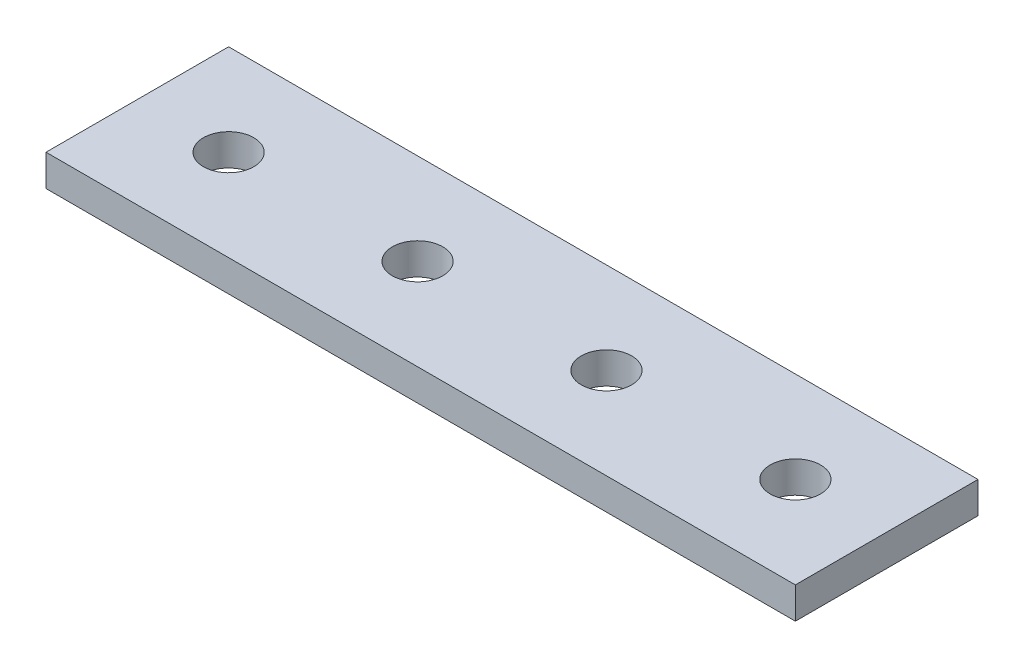
ISO-10303-21;
HEADER;
FILE_DESCRIPTION(('STEP AP214'),'2;1');
FILE_NAME('part.step','',(''),(''),'','','');
FILE_SCHEMA(('AUTOMOTIVE_DESIGN { 1 0 10303 214 1 1 1 1 }'));
ENDSEC;
DATA;
#1=APPLICATION_CONTEXT('core data for automotive mechanical design processes');
#2=APPLICATION_PROTOCOL_DEFINITION('international standard','automotive_design',2000,#1);
#3=PRODUCT_CONTEXT('',#1,'mechanical');
#4=PRODUCT('Part','Part','',(#3));
#5=PRODUCT_RELATED_PRODUCT_CATEGORY('part','',(#4));
#6=PRODUCT_DEFINITION_FORMATION('','',#4);
#7=PRODUCT_DEFINITION_CONTEXT('part definition',#1,'design');
#8=PRODUCT_DEFINITION('design','',#6,#7);
#9=PRODUCT_DEFINITION_SHAPE('','',#8);
#10=(LENGTH_UNIT() NAMED_UNIT(*) SI_UNIT(.MILLI.,.METRE.));
#11=(NAMED_UNIT(*) PLANE_ANGLE_UNIT() SI_UNIT($,.RADIAN.));
#12=(NAMED_UNIT(*) SI_UNIT($,.STERADIAN.) SOLID_ANGLE_UNIT());
#13=UNCERTAINTY_MEASURE_WITH_UNIT(LENGTH_MEASURE(1.E-05),#10,'distance_accuracy_value','');
#14=(GEOMETRIC_REPRESENTATION_CONTEXT(3) GLOBAL_UNCERTAINTY_ASSIGNED_CONTEXT((#13)) GLOBAL_UNIT_ASSIGNED_CONTEXT((#10,
#11,#12)) REPRESENTATION_CONTEXT('',''));
#15=CARTESIAN_POINT('',(0.,0.,0.));
#16=DIRECTION('',(0.,0.,1.));
#17=DIRECTION('',(1.,0.,0.));
#18=AXIS2_PLACEMENT_3D('',#15,#16,#17);
#19=CARTESIAN_POINT('',(47.8,2.,0.));
#20=DIRECTION('',(1.,0.,0.));
#21=DIRECTION('',(0.,0.,-1.));
#22=AXIS2_PLACEMENT_3D('',#19,#20,#21);
#23=PLANE('',#22);
#24=DIRECTION('',(0.,0.,1.));
#25=VECTOR('',#24,1.);
#26=CARTESIAN_POINT('',(47.8,0.,0.));
#27=LINE('',#26,#25);
#28=CARTESIAN_POINT('',(47.8,0.,-11.6));
#29=VERTEX_POINT('',#28);
#30=CARTESIAN_POINT('',(47.8,0.,0.));
#31=VERTEX_POINT('',#30);
#32=EDGE_CURVE('E107',#29,#31,#27,.T.);
#33=ORIENTED_EDGE('',*,*,#32,.F.);
#34=DIRECTION('',(0.,-1.,0.));
#35=VECTOR('',#34,1.);
#36=CARTESIAN_POINT('',(47.8,2.,-11.6));
#37=LINE('',#36,#35);
#38=CARTESIAN_POINT('',(47.8,2.,-11.6));
#39=VERTEX_POINT('',#38);
#40=EDGE_CURVE('E11',#39,#29,#37,.T.);
#41=ORIENTED_EDGE('',*,*,#40,.F.);
#42=DIRECTION('',(0.,0.,1.));
#43=VECTOR('',#42,1.);
#44=CARTESIAN_POINT('',(47.8,2.,0.));
#45=LINE('',#44,#43);
#46=CARTESIAN_POINT('',(47.8,2.,0.));
#47=VERTEX_POINT('',#46);
#48=EDGE_CURVE('E100',#39,#47,#45,.T.);
#49=ORIENTED_EDGE('',*,*,#48,.T.);
#50=DIRECTION('',(0.,-1.,0.));
#51=VECTOR('',#50,1.);
#52=CARTESIAN_POINT('',(47.8,2.,0.));
#53=LINE('',#52,#51);
#54=EDGE_CURVE('E80',#47,#31,#53,.T.);
#55=ORIENTED_EDGE('',*,*,#54,.T.);
#56=EDGE_LOOP('',(#33,#41,#49,#55));
#57=FACE_BOUND('',#56,.T.);
#58=ADVANCED_FACE('F41',(#57),#23,.T.);
#59=CARTESIAN_POINT('',(0.,2.,-11.6));
#60=DIRECTION('',(0.,0.,-1.));
#61=DIRECTION('',(-1.,0.,0.));
#62=AXIS2_PLACEMENT_3D('',#59,#60,#61);
#63=PLANE('',#62);
#64=DIRECTION('',(1.,0.,0.));
#65=VECTOR('',#64,1.);
#66=CARTESIAN_POINT('',(0.,0.,-11.6));
#67=LINE('',#66,#65);
#68=CARTESIAN_POINT('',(0.200000000000001,0.,-11.6));
#69=VERTEX_POINT('',#68);
#70=EDGE_CURVE('E93',#69,#29,#67,.T.);
#71=ORIENTED_EDGE('',*,*,#70,.F.);
#72=DIRECTION('',(0.,-1.,0.));
#73=VECTOR('',#72,1.);
#74=CARTESIAN_POINT('',(0.200000000000001,2.,-11.6));
#75=LINE('',#74,#73);
#76=CARTESIAN_POINT('',(0.200000000000001,2.,-11.6));
#77=VERTEX_POINT('',#76);
#78=EDGE_CURVE('E50',#77,#69,#75,.T.);
#79=ORIENTED_EDGE('',*,*,#78,.F.);
#80=DIRECTION('',(1.,0.,0.));
#81=VECTOR('',#80,1.);
#82=CARTESIAN_POINT('',(0.,2.,-11.6));
#83=LINE('',#82,#81);
#84=EDGE_CURVE('E91',#77,#39,#83,.T.);
#85=ORIENTED_EDGE('',*,*,#84,.T.);
#86=ORIENTED_EDGE('',*,*,#40,.T.);
#87=EDGE_LOOP('',(#71,#79,#85,#86));
#88=FACE_BOUND('',#87,.T.);
#89=ADVANCED_FACE('F89',(#88),#63,.T.);
#90=CARTESIAN_POINT('',(0.200000000000001,2.,0.));
#91=DIRECTION('',(1.,0.,0.));
#92=DIRECTION('',(0.,0.,-1.));
#93=AXIS2_PLACEMENT_3D('',#90,#91,#92);
#94=PLANE('',#93);
#95=DIRECTION('',(0.,0.,1.));
#96=VECTOR('',#95,1.);
#97=CARTESIAN_POINT('',(0.200000000000001,0.,0.));
#98=LINE('',#97,#96);
#99=CARTESIAN_POINT('',(0.200000000000001,0.,0.));
#100=VERTEX_POINT('',#99);
#101=EDGE_CURVE('E73',#69,#100,#98,.T.);
#102=ORIENTED_EDGE('',*,*,#101,.T.);
#103=DIRECTION('',(0.,-1.,0.));
#104=VECTOR('',#103,1.);
#105=CARTESIAN_POINT('',(0.200000000000001,2.,0.));
#106=LINE('',#105,#104);
#107=CARTESIAN_POINT('',(0.200000000000001,2.,0.));
#108=VERTEX_POINT('',#107);
#109=EDGE_CURVE('E94',#108,#100,#106,.T.);
#110=ORIENTED_EDGE('',*,*,#109,.F.);
#111=DIRECTION('',(0.,0.,1.));
#112=VECTOR('',#111,1.);
#113=CARTESIAN_POINT('',(0.200000000000001,2.,0.));
#114=LINE('',#113,#112);
#115=EDGE_CURVE('E96',#77,#108,#114,.T.);
#116=ORIENTED_EDGE('',*,*,#115,.F.);
#117=ORIENTED_EDGE('',*,*,#78,.T.);
#118=EDGE_LOOP('',(#102,#110,#116,#117));
#119=FACE_BOUND('',#118,.T.);
#120=ADVANCED_FACE('F97',(#119),#94,.F.);
#121=CARTESIAN_POINT('',(0.,2.,0.));
#122=DIRECTION('',(0.,0.,-1.));
#123=DIRECTION('',(-1.,0.,0.));
#124=AXIS2_PLACEMENT_3D('',#121,#122,#123);
#125=PLANE('',#124);
#126=DIRECTION('',(1.,0.,0.));
#127=VECTOR('',#126,1.);
#128=CARTESIAN_POINT('',(0.,0.,0.));
#129=LINE('',#128,#127);
#130=EDGE_CURVE('E102',#100,#31,#129,.T.);
#131=ORIENTED_EDGE('',*,*,#130,.T.);
#132=ORIENTED_EDGE('',*,*,#54,.F.);
#133=DIRECTION('',(1.,0.,0.));
#134=VECTOR('',#133,1.);
#135=CARTESIAN_POINT('',(0.,2.,0.));
#136=LINE('',#135,#134);
#137=EDGE_CURVE('E58',#108,#47,#136,.T.);
#138=ORIENTED_EDGE('',*,*,#137,.F.);
#139=ORIENTED_EDGE('',*,*,#109,.T.);
#140=EDGE_LOOP('',(#131,#132,#138,#139));
#141=FACE_BOUND('',#140,.T.);
#142=ADVANCED_FACE('F117',(#141),#125,.F.);
#143=CARTESIAN_POINT('',(0.,2.,0.));
#144=DIRECTION('',(0.,1.,0.));
#145=DIRECTION('',(0.,0.,1.));
#146=AXIS2_PLACEMENT_3D('',#143,#144,#145);
#147=PLANE('',#146);
#148=CARTESIAN_POINT('',(42.,2.,-5.8));
#149=DIRECTION('',(0.,1.,0.));
#150=DIRECTION('',(0.,0.,1.));
#151=AXIS2_PLACEMENT_3D('',#148,#149,#150);
#152=CIRCLE('',#151,1.6);
#153=CARTESIAN_POINT('',(42.,2.,-4.2));
#154=VERTEX_POINT('',#153);
#155=EDGE_CURVE('E157',#154,#154,#152,.T.);
#156=ORIENTED_EDGE('',*,*,#155,.F.);
#157=EDGE_LOOP('',(#156));
#158=FACE_BOUND('',#157,.T.);
#159=CARTESIAN_POINT('',(30.,2.,-5.8));
#160=DIRECTION('',(0.,1.,0.));
#161=DIRECTION('',(0.,0.,1.));
#162=AXIS2_PLACEMENT_3D('',#159,#160,#161);
#163=CIRCLE('',#162,1.6);
#164=CARTESIAN_POINT('',(30.,2.,-4.2));
#165=VERTEX_POINT('',#164);
#166=EDGE_CURVE('E161',#165,#165,#163,.T.);
#167=ORIENTED_EDGE('',*,*,#166,.F.);
#168=EDGE_LOOP('',(#167));
#169=FACE_BOUND('',#168,.T.);
#170=CARTESIAN_POINT('',(18.,2.,-5.8));
#171=DIRECTION('',(0.,1.,0.));
#172=DIRECTION('',(0.,0.,1.));
#173=AXIS2_PLACEMENT_3D('',#170,#171,#172);
#174=CIRCLE('',#173,1.6);
#175=CARTESIAN_POINT('',(18.,2.,-4.2));
#176=VERTEX_POINT('',#175);
#177=EDGE_CURVE('E170',#176,#176,#174,.T.);
#178=ORIENTED_EDGE('',*,*,#177,.F.);
#179=EDGE_LOOP('',(#178));
#180=FACE_BOUND('',#179,.T.);
#181=CARTESIAN_POINT('',(6.,2.,-5.8));
#182=DIRECTION('',(0.,1.,0.));
#183=DIRECTION('',(0.,0.,1.));
#184=AXIS2_PLACEMENT_3D('',#181,#182,#183);
#185=CIRCLE('',#184,1.6);
#186=CARTESIAN_POINT('',(6.,2.,-4.2));
#187=VERTEX_POINT('',#186);
#188=EDGE_CURVE('E173',#187,#187,#185,.T.);
#189=ORIENTED_EDGE('',*,*,#188,.F.);
#190=EDGE_LOOP('',(#189));
#191=FACE_BOUND('',#190,.T.);
#192=ORIENTED_EDGE('',*,*,#48,.F.);
#193=ORIENTED_EDGE('',*,*,#84,.F.);
#194=ORIENTED_EDGE('',*,*,#115,.T.);
#195=ORIENTED_EDGE('',*,*,#137,.T.);
#196=EDGE_LOOP('',(#192,#193,#194,#195));
#197=FACE_BOUND('',#196,.T.);
#198=ADVANCED_FACE('F99',(#158,#169,#180,#191,#197),#147,.T.);
#199=CARTESIAN_POINT('',(0.,0.,0.));
#200=DIRECTION('',(0.,1.,0.));
#201=DIRECTION('',(0.,0.,1.));
#202=AXIS2_PLACEMENT_3D('',#199,#200,#201);
#203=PLANE('',#202);
#204=CARTESIAN_POINT('',(42.,0.,-5.8));
#205=DIRECTION('',(0.,1.,0.));
#206=DIRECTION('',(0.,0.,1.));
#207=AXIS2_PLACEMENT_3D('',#204,#205,#206);
#208=CIRCLE('',#207,1.6);
#209=CARTESIAN_POINT('',(42.,0.,-4.2));
#210=VERTEX_POINT('',#209);
#211=EDGE_CURVE('E160',#210,#210,#208,.T.);
#212=ORIENTED_EDGE('',*,*,#211,.T.);
#213=EDGE_LOOP('',(#212));
#214=FACE_BOUND('',#213,.T.);
#215=CARTESIAN_POINT('',(30.,0.,-5.8));
#216=DIRECTION('',(0.,1.,0.));
#217=DIRECTION('',(0.,0.,1.));
#218=AXIS2_PLACEMENT_3D('',#215,#216,#217);
#219=CIRCLE('',#218,1.6);
#220=CARTESIAN_POINT('',(30.,0.,-4.2));
#221=VERTEX_POINT('',#220);
#222=EDGE_CURVE('E164',#221,#221,#219,.T.);
#223=ORIENTED_EDGE('',*,*,#222,.T.);
#224=EDGE_LOOP('',(#223));
#225=FACE_BOUND('',#224,.T.);
#226=CARTESIAN_POINT('',(18.,0.,-5.8));
#227=DIRECTION('',(0.,1.,0.));
#228=DIRECTION('',(0.,0.,1.));
#229=AXIS2_PLACEMENT_3D('',#226,#227,#228);
#230=CIRCLE('',#229,1.6);
#231=CARTESIAN_POINT('',(18.,0.,-4.2));
#232=VERTEX_POINT('',#231);
#233=EDGE_CURVE('E44',#232,#232,#230,.T.);
#234=ORIENTED_EDGE('',*,*,#233,.T.);
#235=EDGE_LOOP('',(#234));
#236=FACE_BOUND('',#235,.T.);
#237=CARTESIAN_POINT('',(6.,0.,-5.8));
#238=DIRECTION('',(0.,1.,0.));
#239=DIRECTION('',(0.,0.,1.));
#240=AXIS2_PLACEMENT_3D('',#237,#238,#239);
#241=CIRCLE('',#240,1.6);
#242=CARTESIAN_POINT('',(6.,0.,-4.2));
#243=VERTEX_POINT('',#242);
#244=EDGE_CURVE('E110',#243,#243,#241,.T.);
#245=ORIENTED_EDGE('',*,*,#244,.T.);
#246=EDGE_LOOP('',(#245));
#247=FACE_BOUND('',#246,.T.);
#248=ORIENTED_EDGE('',*,*,#32,.T.);
#249=ORIENTED_EDGE('',*,*,#130,.F.);
#250=ORIENTED_EDGE('',*,*,#101,.F.);
#251=ORIENTED_EDGE('',*,*,#70,.T.);
#252=EDGE_LOOP('',(#248,#249,#250,#251));
#253=FACE_BOUND('',#252,.T.);
#254=ADVANCED_FACE('F119',(#214,#225,#236,#247,#253),#203,.F.);
#255=CARTESIAN_POINT('',(6.,2.,-5.8));
#256=DIRECTION('',(0.,1.,0.));
#257=DIRECTION('',(0.,0.,1.));
#258=AXIS2_PLACEMENT_3D('',#255,#256,#257);
#259=CYLINDRICAL_SURFACE('',#258,1.6);
#260=ORIENTED_EDGE('',*,*,#188,.T.);
#261=EDGE_LOOP('',(#260));
#262=FACE_BOUND('',#261,.T.);
#263=ORIENTED_EDGE('',*,*,#244,.F.);
#264=EDGE_LOOP('',(#263));
#265=FACE_BOUND('',#264,.T.);
#266=ADVANCED_FACE('F133',(#262,#265),#259,.F.);
#267=CARTESIAN_POINT('',(18.,2.,-5.8));
#268=DIRECTION('',(0.,1.,0.));
#269=DIRECTION('',(0.,0.,1.));
#270=AXIS2_PLACEMENT_3D('',#267,#268,#269);
#271=CYLINDRICAL_SURFACE('',#270,1.6);
#272=ORIENTED_EDGE('',*,*,#177,.T.);
#273=EDGE_LOOP('',(#272));
#274=FACE_BOUND('',#273,.T.);
#275=ORIENTED_EDGE('',*,*,#233,.F.);
#276=EDGE_LOOP('',(#275));
#277=FACE_BOUND('',#276,.T.);
#278=ADVANCED_FACE('F140',(#274,#277),#271,.F.);
#279=CARTESIAN_POINT('',(30.,2.,-5.8));
#280=DIRECTION('',(0.,1.,0.));
#281=DIRECTION('',(0.,0.,1.));
#282=AXIS2_PLACEMENT_3D('',#279,#280,#281);
#283=CYLINDRICAL_SURFACE('',#282,1.6);
#284=ORIENTED_EDGE('',*,*,#166,.T.);
#285=EDGE_LOOP('',(#284));
#286=FACE_BOUND('',#285,.T.);
#287=ORIENTED_EDGE('',*,*,#222,.F.);
#288=EDGE_LOOP('',(#287));
#289=FACE_BOUND('',#288,.T.);
#290=ADVANCED_FACE('F144',(#286,#289),#283,.F.);
#291=CARTESIAN_POINT('',(42.,2.,-5.8));
#292=DIRECTION('',(0.,1.,0.));
#293=DIRECTION('',(0.,0.,1.));
#294=AXIS2_PLACEMENT_3D('',#291,#292,#293);
#295=CYLINDRICAL_SURFACE('',#294,1.6);
#296=ORIENTED_EDGE('',*,*,#155,.T.);
#297=EDGE_LOOP('',(#296));
#298=FACE_BOUND('',#297,.T.);
#299=ORIENTED_EDGE('',*,*,#211,.F.);
#300=EDGE_LOOP('',(#299));
#301=FACE_BOUND('',#300,.T.);
#302=ADVANCED_FACE('F148',(#298,#301),#295,.F.);
#303=CLOSED_SHELL('',(#58,#89,#120,#142,#198,#254,#266,#278,#290,#302));
#304=MANIFOLD_SOLID_BREP('B2',#303);
#305=ADVANCED_BREP_SHAPE_REPRESENTATION('',(#18,#304),#14);
#306=SHAPE_DEFINITION_REPRESENTATION(#9,#305);
ENDSEC;
END-ISO-10303-21;
